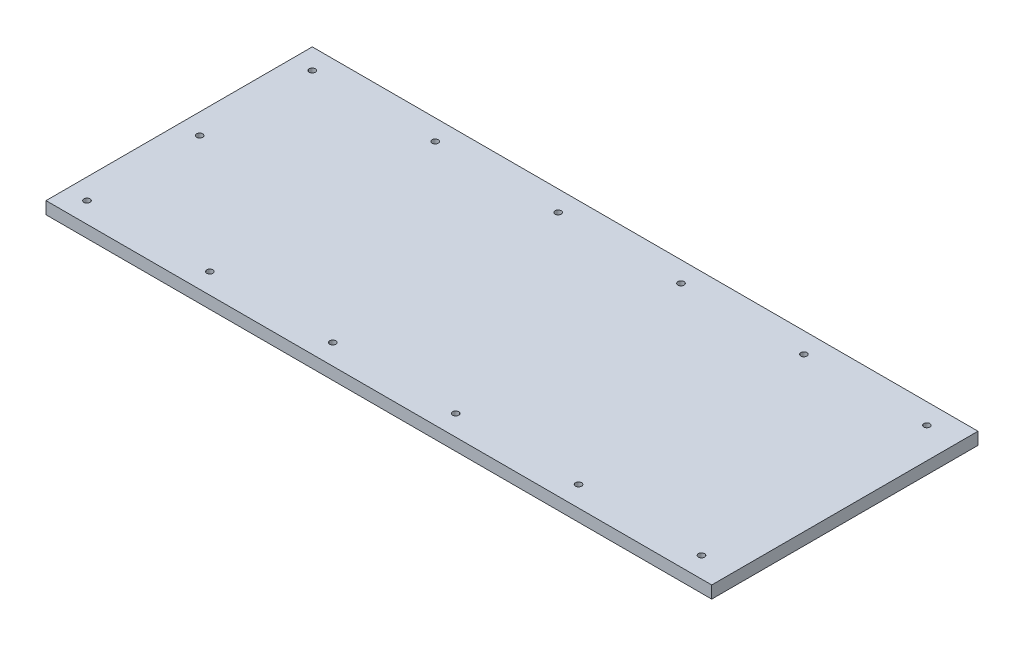
ISO-10303-21;
HEADER;
FILE_DESCRIPTION(('STEP AP214'),'2;1');
FILE_NAME('part.step','',(''),(''),'','','');
FILE_SCHEMA(('AUTOMOTIVE_DESIGN { 1 0 10303 214 1 1 1 1 }'));
ENDSEC;
DATA;
#1=APPLICATION_CONTEXT('core data for automotive mechanical design processes');
#2=APPLICATION_PROTOCOL_DEFINITION('international standard','automotive_design',2000,#1);
#3=PRODUCT_CONTEXT('',#1,'mechanical');
#4=PRODUCT('Part','Part','',(#3));
#5=PRODUCT_RELATED_PRODUCT_CATEGORY('part','',(#4));
#6=PRODUCT_DEFINITION_FORMATION('','',#4);
#7=PRODUCT_DEFINITION_CONTEXT('part definition',#1,'design');
#8=PRODUCT_DEFINITION('design','',#6,#7);
#9=PRODUCT_DEFINITION_SHAPE('','',#8);
#10=(LENGTH_UNIT() NAMED_UNIT(*) SI_UNIT(.MILLI.,.METRE.));
#11=(NAMED_UNIT(*) PLANE_ANGLE_UNIT() SI_UNIT($,.RADIAN.));
#12=(NAMED_UNIT(*) SI_UNIT($,.STERADIAN.) SOLID_ANGLE_UNIT());
#13=UNCERTAINTY_MEASURE_WITH_UNIT(LENGTH_MEASURE(1.E-05),#10,'distance_accuracy_value','');
#14=(GEOMETRIC_REPRESENTATION_CONTEXT(3) GLOBAL_UNCERTAINTY_ASSIGNED_CONTEXT((#13)) GLOBAL_UNIT_ASSIGNED_CONTEXT((#10,
#11,#12)) REPRESENTATION_CONTEXT('',''));
#15=CARTESIAN_POINT('',(0.,0.,0.));
#16=DIRECTION('',(0.,0.,1.));
#17=DIRECTION('',(1.,0.,0.));
#18=AXIS2_PLACEMENT_3D('',#15,#16,#17);
#19=CARTESIAN_POINT('',(0.,6.,0.));
#20=DIRECTION('',(0.,1.,0.));
#21=DIRECTION('',(0.,0.,1.));
#22=AXIS2_PLACEMENT_3D('',#19,#20,#21);
#23=PLANE('',#22);
#24=CARTESIAN_POINT('',(87.5,6.,55.));
#25=DIRECTION('',(0.,1.,0.));
#26=DIRECTION('',(0.,0.,1.));
#27=AXIS2_PLACEMENT_3D('',#24,#25,#26);
#28=CIRCLE('',#27,1.5);
#29=CARTESIAN_POINT('',(87.5,6.,56.5));
#30=VERTEX_POINT('',#29);
#31=EDGE_CURVE('E214',#30,#30,#28,.T.);
#32=ORIENTED_EDGE('',*,*,#31,.F.);
#33=EDGE_LOOP('',(#32));
#34=FACE_BOUND('',#33,.T.);
#35=CARTESIAN_POINT('',(-32.5,6.,55.));
#36=DIRECTION('',(0.,1.,0.));
#37=DIRECTION('',(0.,0.,1.));
#38=AXIS2_PLACEMENT_3D('',#35,#36,#37);
#39=CIRCLE('',#38,1.5);
#40=CARTESIAN_POINT('',(-32.5,6.,56.5));
#41=VERTEX_POINT('',#40);
#42=EDGE_CURVE('E198',#41,#41,#39,.T.);
#43=ORIENTED_EDGE('',*,*,#42,.F.);
#44=EDGE_LOOP('',(#43));
#45=FACE_BOUND('',#44,.T.);
#46=CARTESIAN_POINT('',(-152.5,6.,0.));
#47=DIRECTION('',(0.,1.,0.));
#48=DIRECTION('',(0.,0.,1.));
#49=AXIS2_PLACEMENT_3D('',#46,#47,#48);
#50=CIRCLE('',#49,1.5);
#51=CARTESIAN_POINT('',(-152.5,6.,1.5));
#52=VERTEX_POINT('',#51);
#53=EDGE_CURVE('E182',#52,#52,#50,.T.);
#54=ORIENTED_EDGE('',*,*,#53,.F.);
#55=EDGE_LOOP('',(#54));
#56=FACE_BOUND('',#55,.T.);
#57=CARTESIAN_POINT('',(87.5,6.,-55.));
#58=DIRECTION('',(0.,1.,0.));
#59=DIRECTION('',(0.,0.,1.));
#60=AXIS2_PLACEMENT_3D('',#57,#58,#59);
#61=CIRCLE('',#60,1.5);
#62=CARTESIAN_POINT('',(87.5,6.,-53.5));
#63=VERTEX_POINT('',#62);
#64=EDGE_CURVE('E166',#63,#63,#61,.T.);
#65=ORIENTED_EDGE('',*,*,#64,.F.);
#66=EDGE_LOOP('',(#65));
#67=FACE_BOUND('',#66,.T.);
#68=CARTESIAN_POINT('',(-32.5,6.,-55.));
#69=DIRECTION('',(0.,1.,0.));
#70=DIRECTION('',(0.,0.,1.));
#71=AXIS2_PLACEMENT_3D('',#68,#69,#70);
#72=CIRCLE('',#71,1.5);
#73=CARTESIAN_POINT('',(-32.5,6.,-53.5));
#74=VERTEX_POINT('',#73);
#75=EDGE_CURVE('E150',#74,#74,#72,.T.);
#76=ORIENTED_EDGE('',*,*,#75,.F.);
#77=EDGE_LOOP('',(#76));
#78=FACE_BOUND('',#77,.T.);
#79=CARTESIAN_POINT('',(-152.5,6.,55.));
#80=DIRECTION('',(0.,1.,0.));
#81=DIRECTION('',(0.,0.,1.));
#82=AXIS2_PLACEMENT_3D('',#79,#80,#81);
#83=CIRCLE('',#82,1.5);
#84=CARTESIAN_POINT('',(-152.5,6.,56.5));
#85=VERTEX_POINT('',#84);
#86=EDGE_CURVE('E134',#85,#85,#83,.T.);
#87=ORIENTED_EDGE('',*,*,#86,.F.);
#88=EDGE_LOOP('',(#87));
#89=FACE_BOUND('',#88,.T.);
#90=DIRECTION('',(0.,0.,1.));
#91=VECTOR('',#90,1.);
#92=CARTESIAN_POINT('',(-162.5,6.,-65.));
#93=LINE('',#92,#91);
#94=CARTESIAN_POINT('',(-162.5,6.,-65.));
#95=VERTEX_POINT('',#94);
#96=CARTESIAN_POINT('',(-162.5,6.,65.));
#97=VERTEX_POINT('',#96);
#98=EDGE_CURVE('E92',#95,#97,#93,.T.);
#99=ORIENTED_EDGE('',*,*,#98,.T.);
#100=DIRECTION('',(1.,0.,0.));
#101=VECTOR('',#100,1.);
#102=CARTESIAN_POINT('',(-162.5,6.,65.));
#103=LINE('',#102,#101);
#104=CARTESIAN_POINT('',(162.5,6.,65.));
#105=VERTEX_POINT('',#104);
#106=EDGE_CURVE('E87',#97,#105,#103,.T.);
#107=ORIENTED_EDGE('',*,*,#106,.T.);
#108=DIRECTION('',(0.,0.,-1.));
#109=VECTOR('',#108,1.);
#110=CARTESIAN_POINT('',(162.5,6.,-65.));
#111=LINE('',#110,#109);
#112=CARTESIAN_POINT('',(162.5,6.,-65.));
#113=VERTEX_POINT('',#112);
#114=EDGE_CURVE('E90',#105,#113,#111,.T.);
#115=ORIENTED_EDGE('',*,*,#114,.T.);
#116=DIRECTION('',(-1.,0.,0.));
#117=VECTOR('',#116,1.);
#118=CARTESIAN_POINT('',(-162.5,6.,-65.));
#119=LINE('',#118,#117);
#120=EDGE_CURVE('E57',#113,#95,#119,.T.);
#121=ORIENTED_EDGE('',*,*,#120,.T.);
#122=EDGE_LOOP('',(#99,#107,#115,#121));
#123=FACE_BOUND('',#122,.T.);
#124=CARTESIAN_POINT('',(-152.5,6.,-55.));
#125=DIRECTION('',(0.,1.,0.));
#126=DIRECTION('',(0.,0.,1.));
#127=AXIS2_PLACEMENT_3D('',#124,#125,#126);
#128=CIRCLE('',#127,1.5);
#129=CARTESIAN_POINT('',(-152.5,6.,-53.5));
#130=VERTEX_POINT('',#129);
#131=EDGE_CURVE('E112',#130,#130,#128,.T.);
#132=ORIENTED_EDGE('',*,*,#131,.F.);
#133=EDGE_LOOP('',(#132));
#134=FACE_BOUND('',#133,.T.);
#135=CARTESIAN_POINT('',(-92.5,6.,-55.));
#136=DIRECTION('',(0.,1.,0.));
#137=DIRECTION('',(0.,0.,1.));
#138=AXIS2_PLACEMENT_3D('',#135,#136,#137);
#139=CIRCLE('',#138,1.5);
#140=CARTESIAN_POINT('',(-92.5,6.,-53.5));
#141=VERTEX_POINT('',#140);
#142=EDGE_CURVE('E142',#141,#141,#139,.T.);
#143=ORIENTED_EDGE('',*,*,#142,.F.);
#144=EDGE_LOOP('',(#143));
#145=FACE_BOUND('',#144,.T.);
#146=CARTESIAN_POINT('',(27.5,6.,-55.));
#147=DIRECTION('',(0.,1.,0.));
#148=DIRECTION('',(0.,0.,1.));
#149=AXIS2_PLACEMENT_3D('',#146,#147,#148);
#150=CIRCLE('',#149,1.5);
#151=CARTESIAN_POINT('',(27.5,6.,-53.5));
#152=VERTEX_POINT('',#151);
#153=EDGE_CURVE('E158',#152,#152,#150,.T.);
#154=ORIENTED_EDGE('',*,*,#153,.F.);
#155=EDGE_LOOP('',(#154));
#156=FACE_BOUND('',#155,.T.);
#157=CARTESIAN_POINT('',(147.5,6.,-55.));
#158=DIRECTION('',(0.,1.,0.));
#159=DIRECTION('',(0.,0.,1.));
#160=AXIS2_PLACEMENT_3D('',#157,#158,#159);
#161=CIRCLE('',#160,1.5);
#162=CARTESIAN_POINT('',(147.5,6.,-53.5));
#163=VERTEX_POINT('',#162);
#164=EDGE_CURVE('E174',#163,#163,#161,.T.);
#165=ORIENTED_EDGE('',*,*,#164,.F.);
#166=EDGE_LOOP('',(#165));
#167=FACE_BOUND('',#166,.T.);
#168=CARTESIAN_POINT('',(-92.5,6.,55.));
#169=DIRECTION('',(0.,1.,0.));
#170=DIRECTION('',(0.,0.,1.));
#171=AXIS2_PLACEMENT_3D('',#168,#169,#170);
#172=CIRCLE('',#171,1.5);
#173=CARTESIAN_POINT('',(-92.5,6.,56.5));
#174=VERTEX_POINT('',#173);
#175=EDGE_CURVE('E190',#174,#174,#172,.T.);
#176=ORIENTED_EDGE('',*,*,#175,.F.);
#177=EDGE_LOOP('',(#176));
#178=FACE_BOUND('',#177,.T.);
#179=CARTESIAN_POINT('',(27.5,6.,55.));
#180=DIRECTION('',(0.,1.,0.));
#181=DIRECTION('',(0.,0.,1.));
#182=AXIS2_PLACEMENT_3D('',#179,#180,#181);
#183=CIRCLE('',#182,1.5);
#184=CARTESIAN_POINT('',(27.5,6.,56.5));
#185=VERTEX_POINT('',#184);
#186=EDGE_CURVE('E206',#185,#185,#183,.T.);
#187=ORIENTED_EDGE('',*,*,#186,.F.);
#188=EDGE_LOOP('',(#187));
#189=FACE_BOUND('',#188,.T.);
#190=CARTESIAN_POINT('',(147.5,6.,55.));
#191=DIRECTION('',(0.,1.,0.));
#192=DIRECTION('',(0.,0.,1.));
#193=AXIS2_PLACEMENT_3D('',#190,#191,#192);
#194=CIRCLE('',#193,1.5);
#195=CARTESIAN_POINT('',(147.5,6.,56.5));
#196=VERTEX_POINT('',#195);
#197=EDGE_CURVE('E222',#196,#196,#194,.T.);
#198=ORIENTED_EDGE('',*,*,#197,.F.);
#199=EDGE_LOOP('',(#198));
#200=FACE_BOUND('',#199,.T.);
#201=ADVANCED_FACE('F39',(#34,#45,#56,#67,#78,#89,#123,#134,#145,#156,#167,#178,#189,#200),#23,.T.);
#202=CARTESIAN_POINT('',(0.,0.,0.));
#203=DIRECTION('',(0.,1.,0.));
#204=DIRECTION('',(0.,0.,1.));
#205=AXIS2_PLACEMENT_3D('',#202,#203,#204);
#206=PLANE('',#205);
#207=DIRECTION('',(0.,0.,1.));
#208=VECTOR('',#207,1.);
#209=CARTESIAN_POINT('',(-162.5,0.,-65.));
#210=LINE('',#209,#208);
#211=CARTESIAN_POINT('',(-162.5,0.,-65.));
#212=VERTEX_POINT('',#211);
#213=CARTESIAN_POINT('',(-162.5,0.,65.));
#214=VERTEX_POINT('',#213);
#215=EDGE_CURVE('E108',#212,#214,#210,.T.);
#216=ORIENTED_EDGE('',*,*,#215,.F.);
#217=DIRECTION('',(-1.,0.,0.));
#218=VECTOR('',#217,1.);
#219=CARTESIAN_POINT('',(-162.5,0.,-65.));
#220=LINE('',#219,#218);
#221=CARTESIAN_POINT('',(162.5,0.,-65.));
#222=VERTEX_POINT('',#221);
#223=EDGE_CURVE('E80',#222,#212,#220,.T.);
#224=ORIENTED_EDGE('',*,*,#223,.F.);
#225=DIRECTION('',(0.,0.,-1.));
#226=VECTOR('',#225,1.);
#227=CARTESIAN_POINT('',(162.5,0.,-65.));
#228=LINE('',#227,#226);
#229=CARTESIAN_POINT('',(162.5,0.,65.));
#230=VERTEX_POINT('',#229);
#231=EDGE_CURVE('E74',#230,#222,#228,.T.);
#232=ORIENTED_EDGE('',*,*,#231,.F.);
#233=DIRECTION('',(1.,0.,0.));
#234=VECTOR('',#233,1.);
#235=CARTESIAN_POINT('',(-162.5,0.,65.));
#236=LINE('',#235,#234);
#237=EDGE_CURVE('E97',#214,#230,#236,.T.);
#238=ORIENTED_EDGE('',*,*,#237,.F.);
#239=EDGE_LOOP('',(#216,#224,#232,#238));
#240=FACE_BOUND('',#239,.T.);
#241=CARTESIAN_POINT('',(-152.5,0.,-55.));
#242=DIRECTION('',(0.,1.,0.));
#243=DIRECTION('',(0.,0.,1.));
#244=AXIS2_PLACEMENT_3D('',#241,#242,#243);
#245=CIRCLE('',#244,1.5);
#246=CARTESIAN_POINT('',(-152.5,0.,-53.5));
#247=VERTEX_POINT('',#246);
#248=EDGE_CURVE('E130',#247,#247,#245,.T.);
#249=ORIENTED_EDGE('',*,*,#248,.T.);
#250=EDGE_LOOP('',(#249));
#251=FACE_BOUND('',#250,.T.);
#252=CARTESIAN_POINT('',(-152.5,0.,55.));
#253=DIRECTION('',(0.,1.,0.));
#254=DIRECTION('',(0.,0.,1.));
#255=AXIS2_PLACEMENT_3D('',#252,#253,#254);
#256=CIRCLE('',#255,1.5);
#257=CARTESIAN_POINT('',(-152.5,0.,56.5));
#258=VERTEX_POINT('',#257);
#259=EDGE_CURVE('E138',#258,#258,#256,.T.);
#260=ORIENTED_EDGE('',*,*,#259,.T.);
#261=EDGE_LOOP('',(#260));
#262=FACE_BOUND('',#261,.T.);
#263=CARTESIAN_POINT('',(-92.5,0.,-55.));
#264=DIRECTION('',(0.,1.,0.));
#265=DIRECTION('',(0.,0.,1.));
#266=AXIS2_PLACEMENT_3D('',#263,#264,#265);
#267=CIRCLE('',#266,1.5);
#268=CARTESIAN_POINT('',(-92.5,0.,-53.5));
#269=VERTEX_POINT('',#268);
#270=EDGE_CURVE('E146',#269,#269,#267,.T.);
#271=ORIENTED_EDGE('',*,*,#270,.T.);
#272=EDGE_LOOP('',(#271));
#273=FACE_BOUND('',#272,.T.);
#274=CARTESIAN_POINT('',(-32.5,0.,-55.));
#275=DIRECTION('',(0.,1.,0.));
#276=DIRECTION('',(0.,0.,1.));
#277=AXIS2_PLACEMENT_3D('',#274,#275,#276);
#278=CIRCLE('',#277,1.5);
#279=CARTESIAN_POINT('',(-32.5,0.,-53.5));
#280=VERTEX_POINT('',#279);
#281=EDGE_CURVE('E154',#280,#280,#278,.T.);
#282=ORIENTED_EDGE('',*,*,#281,.T.);
#283=EDGE_LOOP('',(#282));
#284=FACE_BOUND('',#283,.T.);
#285=CARTESIAN_POINT('',(27.5,0.,-55.));
#286=DIRECTION('',(0.,1.,0.));
#287=DIRECTION('',(0.,0.,1.));
#288=AXIS2_PLACEMENT_3D('',#285,#286,#287);
#289=CIRCLE('',#288,1.5);
#290=CARTESIAN_POINT('',(27.5,0.,-53.5));
#291=VERTEX_POINT('',#290);
#292=EDGE_CURVE('E162',#291,#291,#289,.T.);
#293=ORIENTED_EDGE('',*,*,#292,.T.);
#294=EDGE_LOOP('',(#293));
#295=FACE_BOUND('',#294,.T.);
#296=CARTESIAN_POINT('',(87.5,0.,-55.));
#297=DIRECTION('',(0.,1.,0.));
#298=DIRECTION('',(0.,0.,1.));
#299=AXIS2_PLACEMENT_3D('',#296,#297,#298);
#300=CIRCLE('',#299,1.5);
#301=CARTESIAN_POINT('',(87.5,0.,-53.5));
#302=VERTEX_POINT('',#301);
#303=EDGE_CURVE('E170',#302,#302,#300,.T.);
#304=ORIENTED_EDGE('',*,*,#303,.T.);
#305=EDGE_LOOP('',(#304));
#306=FACE_BOUND('',#305,.T.);
#307=CARTESIAN_POINT('',(147.5,0.,-55.));
#308=DIRECTION('',(0.,1.,0.));
#309=DIRECTION('',(0.,0.,1.));
#310=AXIS2_PLACEMENT_3D('',#307,#308,#309);
#311=CIRCLE('',#310,1.5);
#312=CARTESIAN_POINT('',(147.5,0.,-53.5));
#313=VERTEX_POINT('',#312);
#314=EDGE_CURVE('E178',#313,#313,#311,.T.);
#315=ORIENTED_EDGE('',*,*,#314,.T.);
#316=EDGE_LOOP('',(#315));
#317=FACE_BOUND('',#316,.T.);
#318=CARTESIAN_POINT('',(-152.5,0.,0.));
#319=DIRECTION('',(0.,1.,0.));
#320=DIRECTION('',(0.,0.,1.));
#321=AXIS2_PLACEMENT_3D('',#318,#319,#320);
#322=CIRCLE('',#321,1.5);
#323=CARTESIAN_POINT('',(-152.5,0.,1.5));
#324=VERTEX_POINT('',#323);
#325=EDGE_CURVE('E186',#324,#324,#322,.T.);
#326=ORIENTED_EDGE('',*,*,#325,.T.);
#327=EDGE_LOOP('',(#326));
#328=FACE_BOUND('',#327,.T.);
#329=CARTESIAN_POINT('',(-92.5,0.,55.));
#330=DIRECTION('',(0.,1.,0.));
#331=DIRECTION('',(0.,0.,1.));
#332=AXIS2_PLACEMENT_3D('',#329,#330,#331);
#333=CIRCLE('',#332,1.5);
#334=CARTESIAN_POINT('',(-92.5,0.,56.5));
#335=VERTEX_POINT('',#334);
#336=EDGE_CURVE('E194',#335,#335,#333,.T.);
#337=ORIENTED_EDGE('',*,*,#336,.T.);
#338=EDGE_LOOP('',(#337));
#339=FACE_BOUND('',#338,.T.);
#340=CARTESIAN_POINT('',(-32.5,0.,55.));
#341=DIRECTION('',(0.,1.,0.));
#342=DIRECTION('',(0.,0.,1.));
#343=AXIS2_PLACEMENT_3D('',#340,#341,#342);
#344=CIRCLE('',#343,1.5);
#345=CARTESIAN_POINT('',(-32.5,0.,56.5));
#346=VERTEX_POINT('',#345);
#347=EDGE_CURVE('E202',#346,#346,#344,.T.);
#348=ORIENTED_EDGE('',*,*,#347,.T.);
#349=EDGE_LOOP('',(#348));
#350=FACE_BOUND('',#349,.T.);
#351=CARTESIAN_POINT('',(27.5,0.,55.));
#352=DIRECTION('',(0.,1.,0.));
#353=DIRECTION('',(0.,0.,1.));
#354=AXIS2_PLACEMENT_3D('',#351,#352,#353);
#355=CIRCLE('',#354,1.5);
#356=CARTESIAN_POINT('',(27.5,0.,56.5));
#357=VERTEX_POINT('',#356);
#358=EDGE_CURVE('E210',#357,#357,#355,.T.);
#359=ORIENTED_EDGE('',*,*,#358,.T.);
#360=EDGE_LOOP('',(#359));
#361=FACE_BOUND('',#360,.T.);
#362=CARTESIAN_POINT('',(87.5,0.,55.));
#363=DIRECTION('',(0.,1.,0.));
#364=DIRECTION('',(0.,0.,1.));
#365=AXIS2_PLACEMENT_3D('',#362,#363,#364);
#366=CIRCLE('',#365,1.5);
#367=CARTESIAN_POINT('',(87.5,0.,56.5));
#368=VERTEX_POINT('',#367);
#369=EDGE_CURVE('E218',#368,#368,#366,.T.);
#370=ORIENTED_EDGE('',*,*,#369,.T.);
#371=EDGE_LOOP('',(#370));
#372=FACE_BOUND('',#371,.T.);
#373=CARTESIAN_POINT('',(147.5,0.,55.));
#374=DIRECTION('',(0.,1.,0.));
#375=DIRECTION('',(0.,0.,1.));
#376=AXIS2_PLACEMENT_3D('',#373,#374,#375);
#377=CIRCLE('',#376,1.5);
#378=CARTESIAN_POINT('',(147.5,0.,56.5));
#379=VERTEX_POINT('',#378);
#380=EDGE_CURVE('E226',#379,#379,#377,.T.);
#381=ORIENTED_EDGE('',*,*,#380,.T.);
#382=EDGE_LOOP('',(#381));
#383=FACE_BOUND('',#382,.T.);
#384=ADVANCED_FACE('F125',(#240,#251,#262,#273,#284,#295,#306,#317,#328,#339,#350,#361,#372,
#383),#206,.F.);
#385=CARTESIAN_POINT('',(-162.5,6.,-65.));
#386=DIRECTION('',(1.,0.,0.));
#387=DIRECTION('',(0.,0.,-1.));
#388=AXIS2_PLACEMENT_3D('',#385,#386,#387);
#389=PLANE('',#388);
#390=ORIENTED_EDGE('',*,*,#215,.T.);
#391=DIRECTION('',(0.,-1.,0.));
#392=VECTOR('',#391,1.);
#393=CARTESIAN_POINT('',(-162.5,6.,65.));
#394=LINE('',#393,#392);
#395=EDGE_CURVE('E11',#97,#214,#394,.T.);
#396=ORIENTED_EDGE('',*,*,#395,.F.);
#397=ORIENTED_EDGE('',*,*,#98,.F.);
#398=DIRECTION('',(0.,-1.,0.));
#399=VECTOR('',#398,1.);
#400=CARTESIAN_POINT('',(-162.5,6.,-65.));
#401=LINE('',#400,#399);
#402=EDGE_CURVE('E104',#95,#212,#401,.T.);
#403=ORIENTED_EDGE('',*,*,#402,.T.);
#404=EDGE_LOOP('',(#390,#396,#397,#403));
#405=FACE_BOUND('',#404,.T.);
#406=ADVANCED_FACE('F41',(#405),#389,.F.);
#407=CARTESIAN_POINT('',(-162.5,6.,65.));
#408=DIRECTION('',(0.,0.,-1.));
#409=DIRECTION('',(-1.,0.,0.));
#410=AXIS2_PLACEMENT_3D('',#407,#408,#409);
#411=PLANE('',#410);
#412=ORIENTED_EDGE('',*,*,#237,.T.);
#413=DIRECTION('',(0.,-1.,0.));
#414=VECTOR('',#413,1.);
#415=CARTESIAN_POINT('',(162.5,6.,65.));
#416=LINE('',#415,#414);
#417=EDGE_CURVE('E49',#105,#230,#416,.T.);
#418=ORIENTED_EDGE('',*,*,#417,.F.);
#419=ORIENTED_EDGE('',*,*,#106,.F.);
#420=ORIENTED_EDGE('',*,*,#395,.T.);
#421=EDGE_LOOP('',(#412,#418,#419,#420));
#422=FACE_BOUND('',#421,.T.);
#423=ADVANCED_FACE('F96',(#422),#411,.F.);
#424=CARTESIAN_POINT('',(162.5,6.,-65.));
#425=DIRECTION('',(-1.,0.,0.));
#426=DIRECTION('',(0.,0.,1.));
#427=AXIS2_PLACEMENT_3D('',#424,#425,#426);
#428=PLANE('',#427);
#429=ORIENTED_EDGE('',*,*,#231,.T.);
#430=DIRECTION('',(0.,-1.,0.));
#431=VECTOR('',#430,1.);
#432=CARTESIAN_POINT('',(162.5,6.,-65.));
#433=LINE('',#432,#431);
#434=EDGE_CURVE('E99',#113,#222,#433,.T.);
#435=ORIENTED_EDGE('',*,*,#434,.F.);
#436=ORIENTED_EDGE('',*,*,#114,.F.);
#437=ORIENTED_EDGE('',*,*,#417,.T.);
#438=EDGE_LOOP('',(#429,#435,#436,#437));
#439=FACE_BOUND('',#438,.T.);
#440=ADVANCED_FACE('F100',(#439),#428,.F.);
#441=CARTESIAN_POINT('',(-162.5,6.,-65.));
#442=DIRECTION('',(0.,0.,1.));
#443=DIRECTION('',(1.,0.,0.));
#444=AXIS2_PLACEMENT_3D('',#441,#442,#443);
#445=PLANE('',#444);
#446=ORIENTED_EDGE('',*,*,#223,.T.);
#447=ORIENTED_EDGE('',*,*,#402,.F.);
#448=ORIENTED_EDGE('',*,*,#120,.F.);
#449=ORIENTED_EDGE('',*,*,#434,.T.);
#450=EDGE_LOOP('',(#446,#447,#448,#449));
#451=FACE_BOUND('',#450,.T.);
#452=ADVANCED_FACE('F122',(#451),#445,.F.);
#453=CARTESIAN_POINT('',(-152.5,6.,-55.));
#454=DIRECTION('',(0.,-1.,0.));
#455=DIRECTION('',(0.,0.,-1.));
#456=AXIS2_PLACEMENT_3D('',#453,#454,#455);
#457=CYLINDRICAL_SURFACE('',#456,1.5);
#458=ORIENTED_EDGE('',*,*,#131,.T.);
#459=EDGE_LOOP('',(#458));
#460=FACE_BOUND('',#459,.T.);
#461=ORIENTED_EDGE('',*,*,#248,.F.);
#462=EDGE_LOOP('',(#461));
#463=FACE_BOUND('',#462,.T.);
#464=ADVANCED_FACE('F247',(#460,#463),#457,.F.);
#465=CARTESIAN_POINT('',(-152.5,6.,55.));
#466=DIRECTION('',(0.,-1.,0.));
#467=DIRECTION('',(0.,0.,-1.));
#468=AXIS2_PLACEMENT_3D('',#465,#466,#467);
#469=CYLINDRICAL_SURFACE('',#468,1.5);
#470=ORIENTED_EDGE('',*,*,#86,.T.);
#471=EDGE_LOOP('',(#470));
#472=FACE_BOUND('',#471,.T.);
#473=ORIENTED_EDGE('',*,*,#259,.F.);
#474=EDGE_LOOP('',(#473));
#475=FACE_BOUND('',#474,.T.);
#476=ADVANCED_FACE('F293',(#472,#475),#469,.F.);
#477=CARTESIAN_POINT('',(-92.5,6.,-55.));
#478=DIRECTION('',(0.,-1.,0.));
#479=DIRECTION('',(0.,0.,-1.));
#480=AXIS2_PLACEMENT_3D('',#477,#478,#479);
#481=CYLINDRICAL_SURFACE('',#480,1.5);
#482=ORIENTED_EDGE('',*,*,#142,.T.);
#483=EDGE_LOOP('',(#482));
#484=FACE_BOUND('',#483,.T.);
#485=ORIENTED_EDGE('',*,*,#270,.F.);
#486=EDGE_LOOP('',(#485));
#487=FACE_BOUND('',#486,.T.);
#488=ADVANCED_FACE('F301',(#484,#487),#481,.F.);
#489=CARTESIAN_POINT('',(-32.5,6.,-55.));
#490=DIRECTION('',(0.,-1.,0.));
#491=DIRECTION('',(0.,0.,-1.));
#492=AXIS2_PLACEMENT_3D('',#489,#490,#491);
#493=CYLINDRICAL_SURFACE('',#492,1.5);
#494=ORIENTED_EDGE('',*,*,#75,.T.);
#495=EDGE_LOOP('',(#494));
#496=FACE_BOUND('',#495,.T.);
#497=ORIENTED_EDGE('',*,*,#281,.F.);
#498=EDGE_LOOP('',(#497));
#499=FACE_BOUND('',#498,.T.);
#500=ADVANCED_FACE('F309',(#496,#499),#493,.F.);
#501=CARTESIAN_POINT('',(27.5,6.,-55.));
#502=DIRECTION('',(0.,-1.,0.));
#503=DIRECTION('',(0.,0.,-1.));
#504=AXIS2_PLACEMENT_3D('',#501,#502,#503);
#505=CYLINDRICAL_SURFACE('',#504,1.5);
#506=ORIENTED_EDGE('',*,*,#153,.T.);
#507=EDGE_LOOP('',(#506));
#508=FACE_BOUND('',#507,.T.);
#509=ORIENTED_EDGE('',*,*,#292,.F.);
#510=EDGE_LOOP('',(#509));
#511=FACE_BOUND('',#510,.T.);
#512=ADVANCED_FACE('F318',(#508,#511),#505,.F.);
#513=CARTESIAN_POINT('',(87.5,6.,-55.));
#514=DIRECTION('',(0.,-1.,0.));
#515=DIRECTION('',(0.,0.,-1.));
#516=AXIS2_PLACEMENT_3D('',#513,#514,#515);
#517=CYLINDRICAL_SURFACE('',#516,1.5);
#518=ORIENTED_EDGE('',*,*,#64,.T.);
#519=EDGE_LOOP('',(#518));
#520=FACE_BOUND('',#519,.T.);
#521=ORIENTED_EDGE('',*,*,#303,.F.);
#522=EDGE_LOOP('',(#521));
#523=FACE_BOUND('',#522,.T.);
#524=ADVANCED_FACE('F327',(#520,#523),#517,.F.);
#525=CARTESIAN_POINT('',(147.5,6.,-55.));
#526=DIRECTION('',(0.,-1.,0.));
#527=DIRECTION('',(0.,0.,-1.));
#528=AXIS2_PLACEMENT_3D('',#525,#526,#527);
#529=CYLINDRICAL_SURFACE('',#528,1.5);
#530=ORIENTED_EDGE('',*,*,#164,.T.);
#531=EDGE_LOOP('',(#530));
#532=FACE_BOUND('',#531,.T.);
#533=ORIENTED_EDGE('',*,*,#314,.F.);
#534=EDGE_LOOP('',(#533));
#535=FACE_BOUND('',#534,.T.);
#536=ADVANCED_FACE('F336',(#532,#535),#529,.F.);
#537=CARTESIAN_POINT('',(-152.5,6.,0.));
#538=DIRECTION('',(0.,-1.,0.));
#539=DIRECTION('',(0.,0.,-1.));
#540=AXIS2_PLACEMENT_3D('',#537,#538,#539);
#541=CYLINDRICAL_SURFACE('',#540,1.5);
#542=ORIENTED_EDGE('',*,*,#53,.T.);
#543=EDGE_LOOP('',(#542));
#544=FACE_BOUND('',#543,.T.);
#545=ORIENTED_EDGE('',*,*,#325,.F.);
#546=EDGE_LOOP('',(#545));
#547=FACE_BOUND('',#546,.T.);
#548=ADVANCED_FACE('F345',(#544,#547),#541,.F.);
#549=CARTESIAN_POINT('',(-92.5,6.,55.));
#550=DIRECTION('',(0.,-1.,0.));
#551=DIRECTION('',(0.,0.,-1.));
#552=AXIS2_PLACEMENT_3D('',#549,#550,#551);
#553=CYLINDRICAL_SURFACE('',#552,1.5);
#554=ORIENTED_EDGE('',*,*,#175,.T.);
#555=EDGE_LOOP('',(#554));
#556=FACE_BOUND('',#555,.T.);
#557=ORIENTED_EDGE('',*,*,#336,.F.);
#558=EDGE_LOOP('',(#557));
#559=FACE_BOUND('',#558,.T.);
#560=ADVANCED_FACE('F354',(#556,#559),#553,.F.);
#561=CARTESIAN_POINT('',(-32.5,6.,55.));
#562=DIRECTION('',(0.,-1.,0.));
#563=DIRECTION('',(0.,0.,-1.));
#564=AXIS2_PLACEMENT_3D('',#561,#562,#563);
#565=CYLINDRICAL_SURFACE('',#564,1.5);
#566=ORIENTED_EDGE('',*,*,#42,.T.);
#567=EDGE_LOOP('',(#566));
#568=FACE_BOUND('',#567,.T.);
#569=ORIENTED_EDGE('',*,*,#347,.F.);
#570=EDGE_LOOP('',(#569));
#571=FACE_BOUND('',#570,.T.);
#572=ADVANCED_FACE('F363',(#568,#571),#565,.F.);
#573=CARTESIAN_POINT('',(27.5,6.,55.));
#574=DIRECTION('',(0.,-1.,0.));
#575=DIRECTION('',(0.,0.,-1.));
#576=AXIS2_PLACEMENT_3D('',#573,#574,#575);
#577=CYLINDRICAL_SURFACE('',#576,1.5);
#578=ORIENTED_EDGE('',*,*,#186,.T.);
#579=EDGE_LOOP('',(#578));
#580=FACE_BOUND('',#579,.T.);
#581=ORIENTED_EDGE('',*,*,#358,.F.);
#582=EDGE_LOOP('',(#581));
#583=FACE_BOUND('',#582,.T.);
#584=ADVANCED_FACE('F372',(#580,#583),#577,.F.);
#585=CARTESIAN_POINT('',(87.5,6.,55.));
#586=DIRECTION('',(0.,-1.,0.));
#587=DIRECTION('',(0.,0.,-1.));
#588=AXIS2_PLACEMENT_3D('',#585,#586,#587);
#589=CYLINDRICAL_SURFACE('',#588,1.5);
#590=ORIENTED_EDGE('',*,*,#31,.T.);
#591=EDGE_LOOP('',(#590));
#592=FACE_BOUND('',#591,.T.);
#593=ORIENTED_EDGE('',*,*,#369,.F.);
#594=EDGE_LOOP('',(#593));
#595=FACE_BOUND('',#594,.T.);
#596=ADVANCED_FACE('F381',(#592,#595),#589,.F.);
#597=CARTESIAN_POINT('',(147.5,6.,55.));
#598=DIRECTION('',(0.,-1.,0.));
#599=DIRECTION('',(0.,0.,-1.));
#600=AXIS2_PLACEMENT_3D('',#597,#598,#599);
#601=CYLINDRICAL_SURFACE('',#600,1.5);
#602=ORIENTED_EDGE('',*,*,#197,.T.);
#603=EDGE_LOOP('',(#602));
#604=FACE_BOUND('',#603,.T.);
#605=ORIENTED_EDGE('',*,*,#380,.F.);
#606=EDGE_LOOP('',(#605));
#607=FACE_BOUND('',#606,.T.);
#608=ADVANCED_FACE('F234',(#604,#607),#601,.F.);
#609=CLOSED_SHELL('',(#201,#384,#406,#423,#440,#452,#464,#476,#488,#500,#512,#524,#536,#548,
#560,#572,#584,#596,#608));
#610=MANIFOLD_SOLID_BREP('B2',#609);
#611=ADVANCED_BREP_SHAPE_REPRESENTATION('',(#18,#610),#14);
#612=SHAPE_DEFINITION_REPRESENTATION(#9,#611);
ENDSEC;
END-ISO-10303-21;
